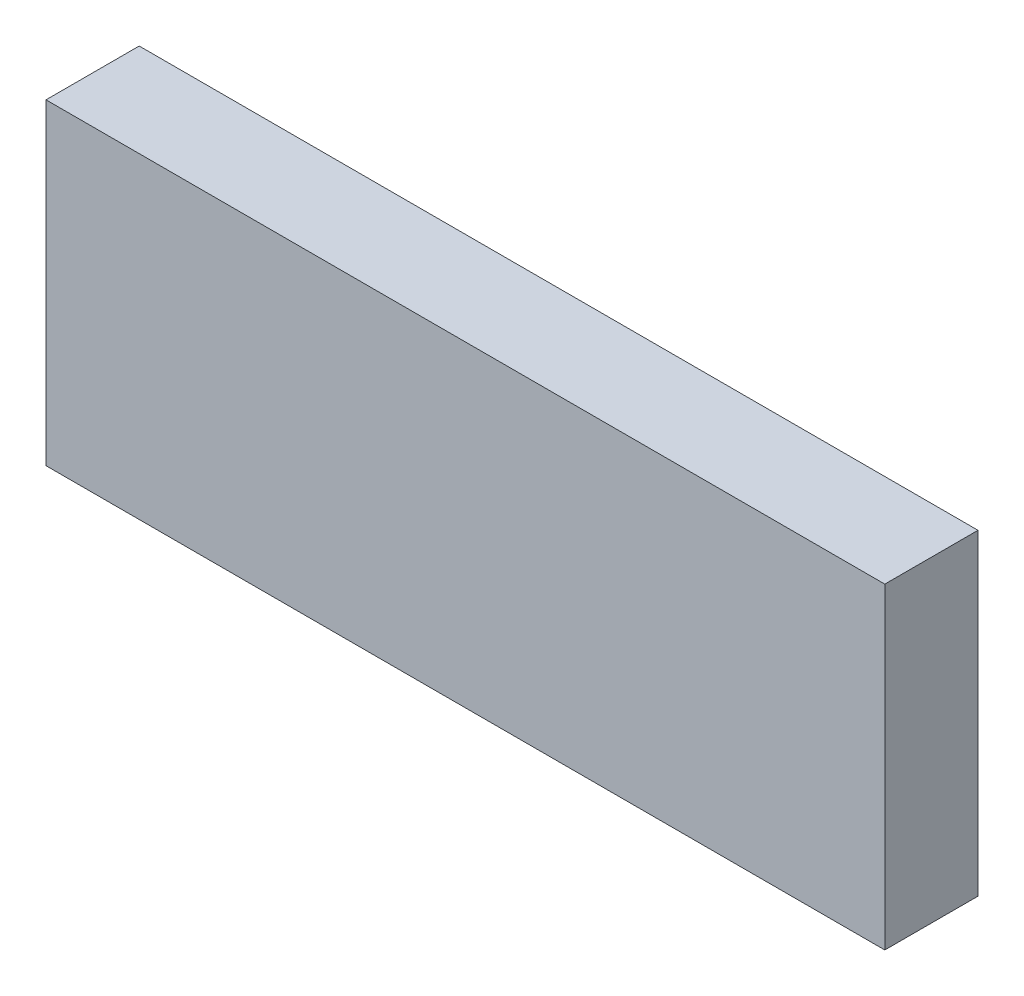
ISO-10303-21;
HEADER;
FILE_DESCRIPTION(('STEP AP214'),'2;1');
FILE_NAME('part.step','',(''),(''),'','','');
FILE_SCHEMA(('AUTOMOTIVE_DESIGN { 1 0 10303 214 1 1 1 1 }'));
ENDSEC;
DATA;
#1=APPLICATION_CONTEXT('core data for automotive mechanical design processes');
#2=APPLICATION_PROTOCOL_DEFINITION('international standard','automotive_design',2000,#1);
#3=PRODUCT_CONTEXT('',#1,'mechanical');
#4=PRODUCT('Part','Part','',(#3));
#5=PRODUCT_RELATED_PRODUCT_CATEGORY('part','',(#4));
#6=PRODUCT_DEFINITION_FORMATION('','',#4);
#7=PRODUCT_DEFINITION_CONTEXT('part definition',#1,'design');
#8=PRODUCT_DEFINITION('design','',#6,#7);
#9=PRODUCT_DEFINITION_SHAPE('','',#8);
#10=(LENGTH_UNIT() NAMED_UNIT(*) SI_UNIT(.MILLI.,.METRE.));
#11=(NAMED_UNIT(*) PLANE_ANGLE_UNIT() SI_UNIT($,.RADIAN.));
#12=(NAMED_UNIT(*) SI_UNIT($,.STERADIAN.) SOLID_ANGLE_UNIT());
#13=UNCERTAINTY_MEASURE_WITH_UNIT(LENGTH_MEASURE(1.E-05),#10,'distance_accuracy_value','');
#14=(GEOMETRIC_REPRESENTATION_CONTEXT(3) GLOBAL_UNCERTAINTY_ASSIGNED_CONTEXT((#13)) GLOBAL_UNIT_ASSIGNED_CONTEXT((#10,
#11,#12)) REPRESENTATION_CONTEXT('',''));
#15=CARTESIAN_POINT('',(0.,0.,0.));
#16=DIRECTION('',(0.,0.,1.));
#17=DIRECTION('',(1.,0.,0.));
#18=AXIS2_PLACEMENT_3D('',#15,#16,#17);
#19=CARTESIAN_POINT('',(0.,0.,500.));
#20=DIRECTION('',(1.,0.,0.));
#21=DIRECTION('',(0.,0.,-1.));
#22=AXIS2_PLACEMENT_3D('',#19,#20,#21);
#23=PLANE('',#22);
#24=DIRECTION('',(0.,-1.,0.));
#25=VECTOR('',#24,1.);
#26=CARTESIAN_POINT('',(0.,0.,0.));
#27=LINE('',#26,#25);
#28=CARTESIAN_POINT('',(0.,1700.,0.));
#29=VERTEX_POINT('',#28);
#30=CARTESIAN_POINT('',(0.,0.,0.));
#31=VERTEX_POINT('',#30);
#32=EDGE_CURVE('E109',#29,#31,#27,.T.);
#33=ORIENTED_EDGE('',*,*,#32,.T.);
#34=DIRECTION('',(0.,0.,-1.));
#35=VECTOR('',#34,1.);
#36=CARTESIAN_POINT('',(0.,0.,500.));
#37=LINE('',#36,#35);
#38=CARTESIAN_POINT('',(0.,0.,500.));
#39=VERTEX_POINT('',#38);
#40=EDGE_CURVE('E11',#39,#31,#37,.T.);
#41=ORIENTED_EDGE('',*,*,#40,.F.);
#42=DIRECTION('',(0.,-1.,0.));
#43=VECTOR('',#42,1.);
#44=CARTESIAN_POINT('',(0.,0.,500.));
#45=LINE('',#44,#43);
#46=CARTESIAN_POINT('',(0.,1700.,500.));
#47=VERTEX_POINT('',#46);
#48=EDGE_CURVE('E92',#47,#39,#45,.T.);
#49=ORIENTED_EDGE('',*,*,#48,.F.);
#50=DIRECTION('',(0.,0.,-1.));
#51=VECTOR('',#50,1.);
#52=CARTESIAN_POINT('',(0.,1700.,500.));
#53=LINE('',#52,#51);
#54=EDGE_CURVE('E105',#47,#29,#53,.T.);
#55=ORIENTED_EDGE('',*,*,#54,.T.);
#56=EDGE_LOOP('',(#33,#41,#49,#55));
#57=FACE_BOUND('',#56,.T.);
#58=ADVANCED_FACE('F40',(#57),#23,.F.);
#59=CARTESIAN_POINT('',(0.,0.,500.));
#60=DIRECTION('',(0.,1.,0.));
#61=DIRECTION('',(0.,0.,1.));
#62=AXIS2_PLACEMENT_3D('',#59,#60,#61);
#63=PLANE('',#62);
#64=DIRECTION('',(1.,0.,0.));
#65=VECTOR('',#64,1.);
#66=CARTESIAN_POINT('',(0.,0.,0.));
#67=LINE('',#66,#65);
#68=CARTESIAN_POINT('',(4500.,0.,0.));
#69=VERTEX_POINT('',#68);
#70=EDGE_CURVE('E97',#31,#69,#67,.T.);
#71=ORIENTED_EDGE('',*,*,#70,.T.);
#72=DIRECTION('',(0.,0.,-1.));
#73=VECTOR('',#72,1.);
#74=CARTESIAN_POINT('',(4500.,0.,500.));
#75=LINE('',#74,#73);
#76=CARTESIAN_POINT('',(4500.,0.,500.));
#77=VERTEX_POINT('',#76);
#78=EDGE_CURVE('E49',#77,#69,#75,.T.);
#79=ORIENTED_EDGE('',*,*,#78,.F.);
#80=DIRECTION('',(1.,0.,0.));
#81=VECTOR('',#80,1.);
#82=CARTESIAN_POINT('',(0.,0.,500.));
#83=LINE('',#82,#81);
#84=EDGE_CURVE('E87',#39,#77,#83,.T.);
#85=ORIENTED_EDGE('',*,*,#84,.F.);
#86=ORIENTED_EDGE('',*,*,#40,.T.);
#87=EDGE_LOOP('',(#71,#79,#85,#86));
#88=FACE_BOUND('',#87,.T.);
#89=ADVANCED_FACE('F96',(#88),#63,.F.);
#90=CARTESIAN_POINT('',(4500.,0.,500.));
#91=DIRECTION('',(-1.,0.,0.));
#92=DIRECTION('',(0.,0.,1.));
#93=AXIS2_PLACEMENT_3D('',#90,#91,#92);
#94=PLANE('',#93);
#95=DIRECTION('',(0.,1.,0.));
#96=VECTOR('',#95,1.);
#97=CARTESIAN_POINT('',(4500.,0.,0.));
#98=LINE('',#97,#96);
#99=CARTESIAN_POINT('',(4500.,1700.,0.));
#100=VERTEX_POINT('',#99);
#101=EDGE_CURVE('E74',#69,#100,#98,.T.);
#102=ORIENTED_EDGE('',*,*,#101,.T.);
#103=DIRECTION('',(0.,0.,-1.));
#104=VECTOR('',#103,1.);
#105=CARTESIAN_POINT('',(4500.,1700.,500.));
#106=LINE('',#105,#104);
#107=CARTESIAN_POINT('',(4500.,1700.,500.));
#108=VERTEX_POINT('',#107);
#109=EDGE_CURVE('E99',#108,#100,#106,.T.);
#110=ORIENTED_EDGE('',*,*,#109,.F.);
#111=DIRECTION('',(0.,1.,0.));
#112=VECTOR('',#111,1.);
#113=CARTESIAN_POINT('',(4500.,0.,500.));
#114=LINE('',#113,#112);
#115=EDGE_CURVE('E90',#77,#108,#114,.T.);
#116=ORIENTED_EDGE('',*,*,#115,.F.);
#117=ORIENTED_EDGE('',*,*,#78,.T.);
#118=EDGE_LOOP('',(#102,#110,#116,#117));
#119=FACE_BOUND('',#118,.T.);
#120=ADVANCED_FACE('F100',(#119),#94,.F.);
#121=CARTESIAN_POINT('',(0.,1700.,500.));
#122=DIRECTION('',(0.,-1.,0.));
#123=DIRECTION('',(0.,0.,-1.));
#124=AXIS2_PLACEMENT_3D('',#121,#122,#123);
#125=PLANE('',#124);
#126=DIRECTION('',(-1.,0.,0.));
#127=VECTOR('',#126,1.);
#128=CARTESIAN_POINT('',(0.,1700.,0.));
#129=LINE('',#128,#127);
#130=EDGE_CURVE('E80',#100,#29,#129,.T.);
#131=ORIENTED_EDGE('',*,*,#130,.T.);
#132=ORIENTED_EDGE('',*,*,#54,.F.);
#133=DIRECTION('',(-1.,0.,0.));
#134=VECTOR('',#133,1.);
#135=CARTESIAN_POINT('',(0.,1700.,500.));
#136=LINE('',#135,#134);
#137=EDGE_CURVE('E57',#108,#47,#136,.T.);
#138=ORIENTED_EDGE('',*,*,#137,.F.);
#139=ORIENTED_EDGE('',*,*,#109,.T.);
#140=EDGE_LOOP('',(#131,#132,#138,#139));
#141=FACE_BOUND('',#140,.T.);
#142=ADVANCED_FACE('F123',(#141),#125,.F.);
#143=CARTESIAN_POINT('',(0.,0.,500.));
#144=DIRECTION('',(0.,0.,-1.));
#145=DIRECTION('',(-1.,0.,0.));
#146=AXIS2_PLACEMENT_3D('',#143,#144,#145);
#147=PLANE('',#146);
#148=ORIENTED_EDGE('',*,*,#48,.T.);
#149=ORIENTED_EDGE('',*,*,#84,.T.);
#150=ORIENTED_EDGE('',*,*,#115,.T.);
#151=ORIENTED_EDGE('',*,*,#137,.T.);
#152=EDGE_LOOP('',(#148,#149,#150,#151));
#153=FACE_BOUND('',#152,.T.);
#154=ADVANCED_FACE('F88',(#153),#147,.F.);
#155=CARTESIAN_POINT('',(0.,0.,0.));
#156=DIRECTION('',(0.,0.,-1.));
#157=DIRECTION('',(-1.,0.,0.));
#158=AXIS2_PLACEMENT_3D('',#155,#156,#157);
#159=PLANE('',#158);
#160=ORIENTED_EDGE('',*,*,#32,.F.);
#161=ORIENTED_EDGE('',*,*,#130,.F.);
#162=ORIENTED_EDGE('',*,*,#101,.F.);
#163=ORIENTED_EDGE('',*,*,#70,.F.);
#164=EDGE_LOOP('',(#160,#161,#162,#163));
#165=FACE_BOUND('',#164,.T.);
#166=ADVANCED_FACE('F126',(#165),#159,.T.);
#167=CLOSED_SHELL('',(#58,#89,#120,#142,#154,#166));
#168=MANIFOLD_SOLID_BREP('B2',#167);
#169=ADVANCED_BREP_SHAPE_REPRESENTATION('',(#18,#168),#14);
#170=SHAPE_DEFINITION_REPRESENTATION(#9,#169);
ENDSEC;
END-ISO-10303-21;
